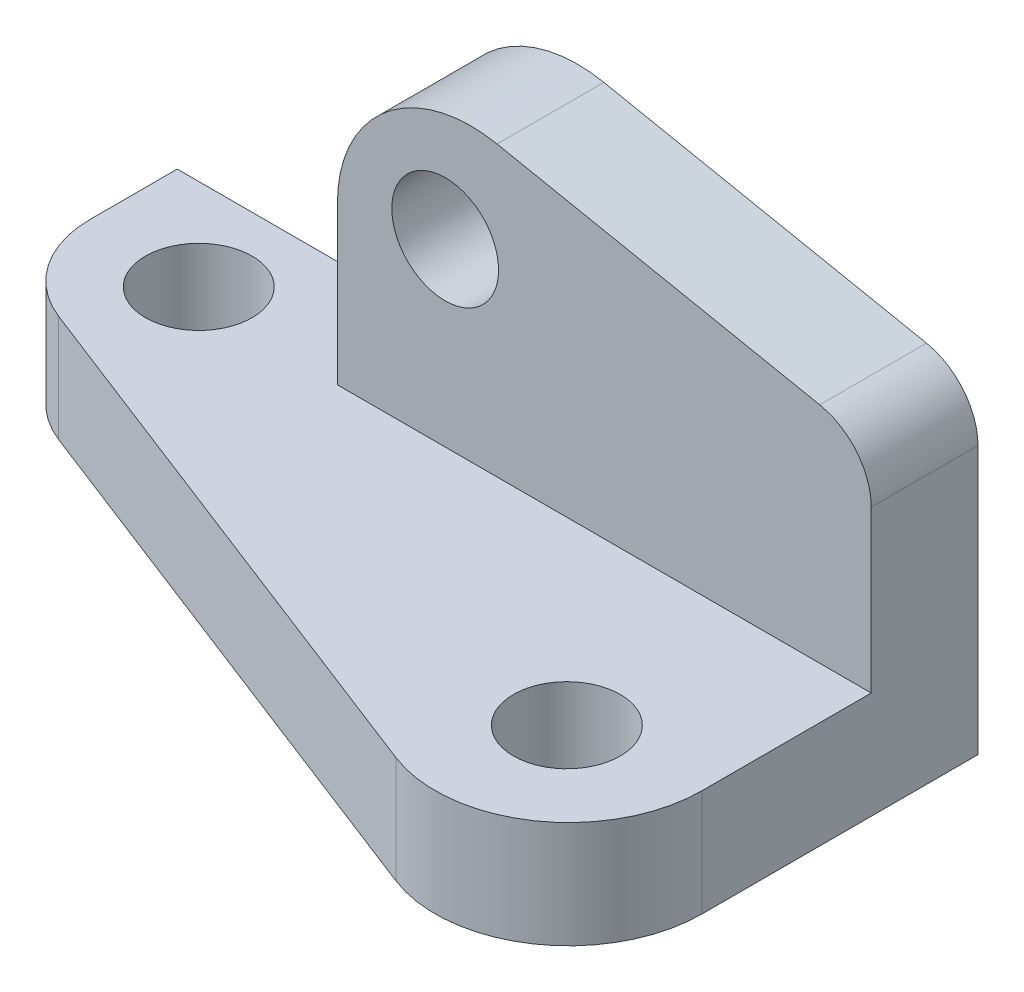
ISO-10303-21;
HEADER;
FILE_DESCRIPTION(('STEP AP214'),'2;1');
FILE_NAME('part.step','',(''),(''),'','','');
FILE_SCHEMA(('AUTOMOTIVE_DESIGN { 1 0 10303 214 1 1 1 1 }'));
ENDSEC;
DATA;
#1=APPLICATION_CONTEXT('core data for automotive mechanical design processes');
#2=APPLICATION_PROTOCOL_DEFINITION('international standard','automotive_design',2000,#1);
#3=PRODUCT_CONTEXT('',#1,'mechanical');
#4=PRODUCT('Part','Part','',(#3));
#5=PRODUCT_RELATED_PRODUCT_CATEGORY('part','',(#4));
#6=PRODUCT_DEFINITION_FORMATION('','',#4);
#7=PRODUCT_DEFINITION_CONTEXT('part definition',#1,'design');
#8=PRODUCT_DEFINITION('design','',#6,#7);
#9=PRODUCT_DEFINITION_SHAPE('','',#8);
#10=(LENGTH_UNIT() NAMED_UNIT(*) SI_UNIT(.MILLI.,.METRE.));
#11=(NAMED_UNIT(*) PLANE_ANGLE_UNIT() SI_UNIT($,.RADIAN.));
#12=(NAMED_UNIT(*) SI_UNIT($,.STERADIAN.) SOLID_ANGLE_UNIT());
#13=UNCERTAINTY_MEASURE_WITH_UNIT(LENGTH_MEASURE(1.E-05),#10,'distance_accuracy_value','');
#14=(GEOMETRIC_REPRESENTATION_CONTEXT(3) GLOBAL_UNCERTAINTY_ASSIGNED_CONTEXT((#13)) GLOBAL_UNIT_ASSIGNED_CONTEXT((#10,
#11,#12)) REPRESENTATION_CONTEXT('',''));
#15=CARTESIAN_POINT('',(0.,0.,0.));
#16=DIRECTION('',(0.,0.,1.));
#17=DIRECTION('',(1.,0.,0.));
#18=AXIS2_PLACEMENT_3D('',#15,#16,#17);
#19=CARTESIAN_POINT('',(20.,20.,16.3519472911813));
#20=DIRECTION('',(0.,1.,0.));
#21=DIRECTION('',(0.,0.,1.));
#22=AXIS2_PLACEMENT_3D('',#19,#20,#21);
#23=PLANE('',#22);
#24=CARTESIAN_POINT('',(126.718781389795,20.,53.737461518237));
#25=DIRECTION('',(0.,1.,0.));
#26=DIRECTION('',(0.,0.,1.));
#27=AXIS2_PLACEMENT_3D('',#24,#25,#26);
#28=CIRCLE('',#27,9.99999999999998);
#29=CARTESIAN_POINT('',(126.718781389795,20.,63.737461518237));
#30=VERTEX_POINT('',#29);
#31=EDGE_CURVE('E225',#30,#30,#28,.T.);
#32=ORIENTED_EDGE('',*,*,#31,.F.);
#33=EDGE_LOOP('',(#32));
#34=FACE_BOUND('',#33,.T.);
#35=CARTESIAN_POINT('',(21.1262693856301,20.,17.1033247004654));
#36=DIRECTION('',(0.,1.,0.));
#37=DIRECTION('',(0.,0.,1.));
#38=AXIS2_PLACEMENT_3D('',#35,#36,#37);
#39=CIRCLE('',#38,9.99999999999999);
#40=CARTESIAN_POINT('',(21.1262693856301,20.,27.1033247004654));
#41=VERTEX_POINT('',#40);
#42=EDGE_CURVE('E219',#41,#41,#39,.T.);
#43=ORIENTED_EDGE('',*,*,#42,.F.);
#44=EDGE_LOOP('',(#43));
#45=FACE_BOUND('',#44,.T.);
#46=DIRECTION('',(1.,0.,0.));
#47=VECTOR('',#46,1.);
#48=CARTESIAN_POINT('',(20.,20.,20.));
#49=LINE('',#48,#47);
#50=CARTESIAN_POINT('',(50.,20.,20.));
#51=VERTEX_POINT('',#50);
#52=CARTESIAN_POINT('',(150.,20.,20.));
#53=VERTEX_POINT('',#52);
#54=EDGE_CURVE('E143',#51,#53,#49,.T.);
#55=ORIENTED_EDGE('',*,*,#54,.F.);
#56=DIRECTION('',(0.,0.,-1.));
#57=VECTOR('',#56,1.);
#58=CARTESIAN_POINT('',(50.,20.,16.3519472911813));
#59=LINE('',#58,#57);
#60=CARTESIAN_POINT('',(50.,20.,0.));
#61=VERTEX_POINT('',#60);
#62=EDGE_CURVE('E124',#51,#61,#59,.T.);
#63=ORIENTED_EDGE('',*,*,#62,.T.);
#64=DIRECTION('',(-1.,0.,0.));
#65=VECTOR('',#64,1.);
#66=CARTESIAN_POINT('',(0.,20.,0.));
#67=LINE('',#66,#65);
#68=CARTESIAN_POINT('',(0.,20.,0.));
#69=VERTEX_POINT('',#68);
#70=EDGE_CURVE('E132',#61,#69,#67,.T.);
#71=ORIENTED_EDGE('',*,*,#70,.T.);
#72=DIRECTION('',(0.,0.,1.));
#73=VECTOR('',#72,1.);
#74=CARTESIAN_POINT('',(0.,20.,0.));
#75=LINE('',#74,#73);
#76=CARTESIAN_POINT('',(0.,20.,16.3519472911813));
#77=VERTEX_POINT('',#76);
#78=EDGE_CURVE('E152',#69,#77,#75,.T.);
#79=ORIENTED_EDGE('',*,*,#78,.T.);
#80=CARTESIAN_POINT('',(20.,20.,16.3519472911813));
#81=DIRECTION('',(0.,1.,0.));
#82=DIRECTION('',(0.,0.,1.));
#83=AXIS2_PLACEMENT_3D('',#80,#81,#82);
#84=CIRCLE('',#83,20.);
#85=CARTESIAN_POINT('',(12.7715748486188,20.,35.));
#86=VERTEX_POINT('',#85);
#87=EDGE_CURVE('E154',#77,#86,#84,.T.);
#88=ORIENTED_EDGE('',*,*,#87,.T.);
#89=DIRECTION('',(0.932402635440934,0.,0.36142125756906));
#90=VECTOR('',#89,1.);
#91=CARTESIAN_POINT('',(115.964468560773,20.,75.));
#92=LINE('',#91,#90);
#93=CARTESIAN_POINT('',(115.964468560773,20.,75.));
#94=VERTEX_POINT('',#93);
#95=EDGE_CURVE('E157',#86,#94,#92,.T.);
#96=ORIENTED_EDGE('',*,*,#95,.T.);
#97=CARTESIAN_POINT('',(125.,20.,51.6899341139767));
#98=DIRECTION('',(0.,1.,0.));
#99=DIRECTION('',(0.,0.,-1.));
#100=AXIS2_PLACEMENT_3D('',#97,#98,#99);
#101=CIRCLE('',#100,25.);
#102=CARTESIAN_POINT('',(150.,20.,51.6899341139767));
#103=VERTEX_POINT('',#102);
#104=EDGE_CURVE('E159',#94,#103,#101,.T.);
#105=ORIENTED_EDGE('',*,*,#104,.T.);
#106=DIRECTION('',(0.,0.,-1.));
#107=VECTOR('',#106,1.);
#108=CARTESIAN_POINT('',(150.,20.,0.));
#109=LINE('',#108,#107);
#110=EDGE_CURVE('E139',#103,#53,#109,.T.);
#111=ORIENTED_EDGE('',*,*,#110,.T.);
#112=EDGE_LOOP('',(#55,#63,#71,#79,#88,#96,#105,#111));
#113=FACE_BOUND('',#112,.T.);
#114=ADVANCED_FACE('F36',(#34,#45,#113),#23,.T.);
#115=CARTESIAN_POINT('',(0.,20.,0.));
#116=DIRECTION('',(1.,0.,0.));
#117=DIRECTION('',(0.,0.,-1.));
#118=AXIS2_PLACEMENT_3D('',#115,#116,#117);
#119=PLANE('',#118);
#120=DIRECTION('',(0.,0.,1.));
#121=VECTOR('',#120,1.);
#122=CARTESIAN_POINT('',(0.,0.,0.));
#123=LINE('',#122,#121);
#124=CARTESIAN_POINT('',(0.,0.,0.));
#125=VERTEX_POINT('',#124);
#126=CARTESIAN_POINT('',(0.,0.,16.3519472911813));
#127=VERTEX_POINT('',#126);
#128=EDGE_CURVE('E144',#125,#127,#123,.T.);
#129=ORIENTED_EDGE('',*,*,#128,.T.);
#130=DIRECTION('',(0.,-1.,0.));
#131=VECTOR('',#130,1.);
#132=CARTESIAN_POINT('',(0.,20.,16.3519472911813));
#133=LINE('',#132,#131);
#134=EDGE_CURVE('E183',#77,#127,#133,.T.);
#135=ORIENTED_EDGE('',*,*,#134,.F.);
#136=ORIENTED_EDGE('',*,*,#78,.F.);
#137=DIRECTION('',(0.,-1.,0.));
#138=VECTOR('',#137,1.);
#139=CARTESIAN_POINT('',(0.,20.,0.));
#140=LINE('',#139,#138);
#141=EDGE_CURVE('E135',#69,#125,#140,.T.);
#142=ORIENTED_EDGE('',*,*,#141,.T.);
#143=EDGE_LOOP('',(#129,#135,#136,#142));
#144=FACE_BOUND('',#143,.T.);
#145=ADVANCED_FACE('F233',(#144),#119,.F.);
#146=CARTESIAN_POINT('',(20.,20.,16.3519472911813));
#147=DIRECTION('',(0.,-1.,0.));
#148=DIRECTION('',(0.,0.,-1.));
#149=AXIS2_PLACEMENT_3D('',#146,#147,#148);
#150=CYLINDRICAL_SURFACE('',#149,20.);
#151=CARTESIAN_POINT('',(20.,0.,16.3519472911813));
#152=DIRECTION('',(0.,1.,0.));
#153=DIRECTION('',(0.,0.,1.));
#154=AXIS2_PLACEMENT_3D('',#151,#152,#153);
#155=CIRCLE('',#154,20.);
#156=CARTESIAN_POINT('',(12.7715748486188,0.,35.));
#157=VERTEX_POINT('',#156);
#158=EDGE_CURVE('E147',#127,#157,#155,.T.);
#159=ORIENTED_EDGE('',*,*,#158,.T.);
#160=DIRECTION('',(0.,-1.,0.));
#161=VECTOR('',#160,1.);
#162=CARTESIAN_POINT('',(12.7715748486188,20.,35.));
#163=LINE('',#162,#161);
#164=EDGE_CURVE('E180',#86,#157,#163,.T.);
#165=ORIENTED_EDGE('',*,*,#164,.F.);
#166=ORIENTED_EDGE('',*,*,#87,.F.);
#167=ORIENTED_EDGE('',*,*,#134,.T.);
#168=EDGE_LOOP('',(#159,#165,#166,#167));
#169=FACE_BOUND('',#168,.T.);
#170=ADVANCED_FACE('F278',(#169),#150,.T.);
#171=CARTESIAN_POINT('',(115.964468560773,20.,75.));
#172=DIRECTION('',(0.361421257569061,0.,-0.932402635440934));
#173=DIRECTION('',(-0.932402635440934,0.,-0.361421257569061));
#174=AXIS2_PLACEMENT_3D('',#171,#172,#173);
#175=PLANE('',#174);
#176=DIRECTION('',(0.932402635440934,0.,0.36142125756906));
#177=VECTOR('',#176,1.);
#178=CARTESIAN_POINT('',(115.964468560773,0.,75.));
#179=LINE('',#178,#177);
#180=CARTESIAN_POINT('',(115.964468560773,0.,75.));
#181=VERTEX_POINT('',#180);
#182=EDGE_CURVE('E163',#157,#181,#179,.T.);
#183=ORIENTED_EDGE('',*,*,#182,.T.);
#184=DIRECTION('',(0.,-1.,0.));
#185=VECTOR('',#184,1.);
#186=CARTESIAN_POINT('',(115.964468560773,20.,75.));
#187=LINE('',#186,#185);
#188=EDGE_CURVE('E177',#94,#181,#187,.T.);
#189=ORIENTED_EDGE('',*,*,#188,.F.);
#190=ORIENTED_EDGE('',*,*,#95,.F.);
#191=ORIENTED_EDGE('',*,*,#164,.T.);
#192=EDGE_LOOP('',(#183,#189,#190,#191));
#193=FACE_BOUND('',#192,.T.);
#194=ADVANCED_FACE('F274',(#193),#175,.F.);
#195=CARTESIAN_POINT('',(125.,20.,51.6899341139767));
#196=DIRECTION('',(0.,-1.,0.));
#197=DIRECTION('',(0.,0.,-1.));
#198=AXIS2_PLACEMENT_3D('',#195,#196,#197);
#199=CYLINDRICAL_SURFACE('',#198,25.);
#200=CARTESIAN_POINT('',(125.,0.,51.6899341139767));
#201=DIRECTION('',(0.,1.,0.));
#202=DIRECTION('',(0.,0.,-1.));
#203=AXIS2_PLACEMENT_3D('',#200,#201,#202);
#204=CIRCLE('',#203,25.);
#205=CARTESIAN_POINT('',(150.,0.,51.6899341139767));
#206=VERTEX_POINT('',#205);
#207=EDGE_CURVE('E165',#181,#206,#204,.T.);
#208=ORIENTED_EDGE('',*,*,#207,.T.);
#209=DIRECTION('',(0.,-1.,0.));
#210=VECTOR('',#209,1.);
#211=CARTESIAN_POINT('',(150.,20.,51.6899341139767));
#212=LINE('',#211,#210);
#213=EDGE_CURVE('E174',#103,#206,#212,.T.);
#214=ORIENTED_EDGE('',*,*,#213,.F.);
#215=ORIENTED_EDGE('',*,*,#104,.F.);
#216=ORIENTED_EDGE('',*,*,#188,.T.);
#217=EDGE_LOOP('',(#208,#214,#215,#216));
#218=FACE_BOUND('',#217,.T.);
#219=ADVANCED_FACE('F271',(#218),#199,.T.);
#220=CARTESIAN_POINT('',(150.,20.,0.));
#221=DIRECTION('',(-1.,0.,0.));
#222=DIRECTION('',(0.,0.,1.));
#223=AXIS2_PLACEMENT_3D('',#220,#221,#222);
#224=PLANE('',#223);
#225=DIRECTION('',(0.,-1.,0.));
#226=VECTOR('',#225,1.);
#227=CARTESIAN_POINT('',(150.,20.,0.));
#228=LINE('',#227,#226);
#229=CARTESIAN_POINT('',(150.,50.1623531673773,0.));
#230=VERTEX_POINT('',#229);
#231=CARTESIAN_POINT('',(150.,0.,0.));
#232=VERTEX_POINT('',#231);
#233=EDGE_CURVE('E172',#230,#232,#228,.T.);
#234=ORIENTED_EDGE('',*,*,#233,.F.);
#235=DIRECTION('',(0.,0.,-1.));
#236=VECTOR('',#235,1.);
#237=CARTESIAN_POINT('',(150.,50.1623531673773,0.));
#238=LINE('',#237,#236);
#239=CARTESIAN_POINT('',(150.,50.1623531673773,20.));
#240=VERTEX_POINT('',#239);
#241=EDGE_CURVE('E44',#230,#240,#238,.F.);
#242=ORIENTED_EDGE('',*,*,#241,.T.);
#243=DIRECTION('',(0.,1.,0.));
#244=VECTOR('',#243,1.);
#245=CARTESIAN_POINT('',(150.,0.,20.));
#246=LINE('',#245,#244);
#247=EDGE_CURVE('E128',#53,#240,#246,.T.);
#248=ORIENTED_EDGE('',*,*,#247,.F.);
#249=ORIENTED_EDGE('',*,*,#110,.F.);
#250=ORIENTED_EDGE('',*,*,#213,.T.);
#251=DIRECTION('',(0.,0.,-1.));
#252=VECTOR('',#251,1.);
#253=CARTESIAN_POINT('',(150.,0.,0.));
#254=LINE('',#253,#252);
#255=EDGE_CURVE('E167',#206,#232,#254,.T.);
#256=ORIENTED_EDGE('',*,*,#255,.T.);
#257=EDGE_LOOP('',(#234,#242,#248,#249,#250,#256));
#258=FACE_BOUND('',#257,.T.);
#259=ADVANCED_FACE('F267',(#258),#224,.F.);
#260=CARTESIAN_POINT('',(0.,20.,0.));
#261=DIRECTION('',(0.,0.,1.));
#262=DIRECTION('',(1.,0.,0.));
#263=AXIS2_PLACEMENT_3D('',#260,#261,#262);
#264=PLANE('',#263);
#265=CARTESIAN_POINT('',(70.1851600843924,53.7137408008803,0.));
#266=DIRECTION('',(0.,0.,1.));
#267=DIRECTION('',(1.,0.,0.));
#268=AXIS2_PLACEMENT_3D('',#265,#266,#267);
#269=CIRCLE('',#268,9.99999999999999);
#270=CARTESIAN_POINT('',(80.1851600843924,53.7137408008803,0.));
#271=VERTEX_POINT('',#270);
#272=EDGE_CURVE('E205',#271,#271,#269,.T.);
#273=ORIENTED_EDGE('',*,*,#272,.T.);
#274=EDGE_LOOP('',(#273));
#275=FACE_BOUND('',#274,.T.);
#276=DIRECTION('',(-0.98058067569092,0.196116135138184,0.));
#277=VECTOR('',#276,1.);
#278=CARTESIAN_POINT('',(150.,60.,0.));
#279=LINE('',#278,#277);
#280=CARTESIAN_POINT('',(140.353393621658,61.9293212756684,0.));
#281=VERTEX_POINT('',#280);
#282=CARTESIAN_POINT('',(79.9029033784546,74.0194193243091,0.));
#283=VERTEX_POINT('',#282);
#284=EDGE_CURVE('E129',#281,#283,#279,.T.);
#285=ORIENTED_EDGE('',*,*,#284,.F.);
#286=CARTESIAN_POINT('',(138.,50.1623531673773,0.));
#287=DIRECTION('',(0.,0.,1.));
#288=DIRECTION('',(1.,0.,0.));
#289=AXIS2_PLACEMENT_3D('',#286,#287,#288);
#290=CIRCLE('',#289,12.);
#291=EDGE_CURVE('E58',#281,#230,#290,.F.);
#292=ORIENTED_EDGE('',*,*,#291,.T.);
#293=ORIENTED_EDGE('',*,*,#233,.T.);
#294=DIRECTION('',(-1.,0.,0.));
#295=VECTOR('',#294,1.);
#296=CARTESIAN_POINT('',(0.,0.,0.));
#297=LINE('',#296,#295);
#298=EDGE_CURVE('E155',#232,#125,#297,.T.);
#299=ORIENTED_EDGE('',*,*,#298,.T.);
#300=ORIENTED_EDGE('',*,*,#141,.F.);
#301=ORIENTED_EDGE('',*,*,#70,.F.);
#302=DIRECTION('',(0.,-1.,0.));
#303=VECTOR('',#302,1.);
#304=CARTESIAN_POINT('',(50.,0.,0.));
#305=LINE('',#304,#303);
#306=CARTESIAN_POINT('',(50.,49.5049024320361,0.));
#307=VERTEX_POINT('',#306);
#308=EDGE_CURVE('E119',#307,#61,#305,.T.);
#309=ORIENTED_EDGE('',*,*,#308,.F.);
#310=CARTESIAN_POINT('',(75.,49.5049024320361,0.));
#311=DIRECTION('',(0.,0.,1.));
#312=DIRECTION('',(1.,0.,0.));
#313=AXIS2_PLACEMENT_3D('',#310,#311,#312);
#314=CIRCLE('',#313,25.);
#315=EDGE_CURVE('E187',#307,#283,#314,.F.);
#316=ORIENTED_EDGE('',*,*,#315,.T.);
#317=EDGE_LOOP('',(#285,#292,#293,#299,#300,#301,#309,#316));
#318=FACE_BOUND('',#317,.T.);
#319=ADVANCED_FACE('F133',(#275,#318),#264,.F.);
#320=CARTESIAN_POINT('',(20.,0.,16.3519472911813));
#321=DIRECTION('',(0.,1.,0.));
#322=DIRECTION('',(0.,0.,1.));
#323=AXIS2_PLACEMENT_3D('',#320,#321,#322);
#324=PLANE('',#323);
#325=CARTESIAN_POINT('',(126.718781389795,0.,53.737461518237));
#326=DIRECTION('',(0.,1.,0.));
#327=DIRECTION('',(0.,0.,1.));
#328=AXIS2_PLACEMENT_3D('',#325,#326,#327);
#329=CIRCLE('',#328,9.99999999999998);
#330=CARTESIAN_POINT('',(126.718781389795,0.,63.737461518237));
#331=VERTEX_POINT('',#330);
#332=EDGE_CURVE('E222',#331,#331,#329,.T.);
#333=ORIENTED_EDGE('',*,*,#332,.T.);
#334=EDGE_LOOP('',(#333));
#335=FACE_BOUND('',#334,.T.);
#336=CARTESIAN_POINT('',(21.1262693856301,0.,17.1033247004654));
#337=DIRECTION('',(0.,1.,0.));
#338=DIRECTION('',(0.,0.,1.));
#339=AXIS2_PLACEMENT_3D('',#336,#337,#338);
#340=CIRCLE('',#339,9.99999999999999);
#341=CARTESIAN_POINT('',(21.1262693856301,0.,27.1033247004654));
#342=VERTEX_POINT('',#341);
#343=EDGE_CURVE('E216',#342,#342,#340,.T.);
#344=ORIENTED_EDGE('',*,*,#343,.T.);
#345=EDGE_LOOP('',(#344));
#346=FACE_BOUND('',#345,.T.);
#347=ORIENTED_EDGE('',*,*,#128,.F.);
#348=ORIENTED_EDGE('',*,*,#298,.F.);
#349=ORIENTED_EDGE('',*,*,#255,.F.);
#350=ORIENTED_EDGE('',*,*,#207,.F.);
#351=ORIENTED_EDGE('',*,*,#182,.F.);
#352=ORIENTED_EDGE('',*,*,#158,.F.);
#353=EDGE_LOOP('',(#347,#348,#349,#350,#351,#352));
#354=FACE_BOUND('',#353,.T.);
#355=ADVANCED_FACE('F260',(#335,#346,#354),#324,.F.);
#356=CARTESIAN_POINT('',(150.,60.,20.));
#357=DIRECTION('',(-0.196116135138184,-0.98058067569092,0.));
#358=DIRECTION('',(0.98058067569092,-0.196116135138184,0.));
#359=AXIS2_PLACEMENT_3D('',#356,#357,#358);
#360=PLANE('',#359);
#361=DIRECTION('',(-0.98058067569092,0.196116135138184,0.));
#362=VECTOR('',#361,1.);
#363=CARTESIAN_POINT('',(150.,60.,20.));
#364=LINE('',#363,#362);
#365=CARTESIAN_POINT('',(140.353393621658,61.9293212756684,20.));
#366=VERTEX_POINT('',#365);
#367=CARTESIAN_POINT('',(79.9029033784546,74.0194193243091,20.));
#368=VERTEX_POINT('',#367);
#369=EDGE_CURVE('E201',#366,#368,#364,.T.);
#370=ORIENTED_EDGE('',*,*,#369,.F.);
#371=DIRECTION('',(0.,0.,-1.));
#372=VECTOR('',#371,1.);
#373=CARTESIAN_POINT('',(140.353393621658,61.9293212756684,20.));
#374=LINE('',#373,#372);
#375=EDGE_CURVE('E194',#366,#281,#374,.T.);
#376=ORIENTED_EDGE('',*,*,#375,.T.);
#377=ORIENTED_EDGE('',*,*,#284,.T.);
#378=DIRECTION('',(0.,0.,-1.));
#379=VECTOR('',#378,1.);
#380=CARTESIAN_POINT('',(79.9029033784546,74.0194193243091,20.));
#381=LINE('',#380,#379);
#382=EDGE_CURVE('E189',#283,#368,#381,.F.);
#383=ORIENTED_EDGE('',*,*,#382,.T.);
#384=EDGE_LOOP('',(#370,#376,#377,#383));
#385=FACE_BOUND('',#384,.T.);
#386=ADVANCED_FACE('F200',(#385),#360,.F.);
#387=CARTESIAN_POINT('',(50.,0.,20.));
#388=DIRECTION('',(1.,0.,0.));
#389=DIRECTION('',(0.,0.,-1.));
#390=AXIS2_PLACEMENT_3D('',#387,#388,#389);
#391=PLANE('',#390);
#392=DIRECTION('',(0.,-1.,0.));
#393=VECTOR('',#392,1.);
#394=CARTESIAN_POINT('',(50.,0.,20.));
#395=LINE('',#394,#393);
#396=CARTESIAN_POINT('',(50.,49.5049024320361,20.));
#397=VERTEX_POINT('',#396);
#398=EDGE_CURVE('E149',#397,#51,#395,.T.);
#399=ORIENTED_EDGE('',*,*,#398,.F.);
#400=DIRECTION('',(0.,0.,-1.));
#401=VECTOR('',#400,1.);
#402=CARTESIAN_POINT('',(50.,49.5049024320361,20.));
#403=LINE('',#402,#401);
#404=EDGE_CURVE('E126',#397,#307,#403,.T.);
#405=ORIENTED_EDGE('',*,*,#404,.T.);
#406=ORIENTED_EDGE('',*,*,#308,.T.);
#407=ORIENTED_EDGE('',*,*,#62,.F.);
#408=EDGE_LOOP('',(#399,#405,#406,#407));
#409=FACE_BOUND('',#408,.T.);
#410=ADVANCED_FACE('F122',(#409),#391,.F.);
#411=CARTESIAN_POINT('',(0.,0.,20.));
#412=DIRECTION('',(0.,0.,1.));
#413=DIRECTION('',(1.,0.,0.));
#414=AXIS2_PLACEMENT_3D('',#411,#412,#413);
#415=PLANE('',#414);
#416=CARTESIAN_POINT('',(70.1851600843924,53.7137408008803,20.));
#417=DIRECTION('',(0.,0.,1.));
#418=DIRECTION('',(1.,0.,0.));
#419=AXIS2_PLACEMENT_3D('',#416,#417,#418);
#420=CIRCLE('',#419,9.99999999999998);
#421=CARTESIAN_POINT('',(80.1851600843923,53.7137408008803,20.));
#422=VERTEX_POINT('',#421);
#423=EDGE_CURVE('E208',#422,#422,#420,.T.);
#424=ORIENTED_EDGE('',*,*,#423,.F.);
#425=EDGE_LOOP('',(#424));
#426=FACE_BOUND('',#425,.T.);
#427=ORIENTED_EDGE('',*,*,#247,.T.);
#428=CARTESIAN_POINT('',(138.,50.1623531673773,20.));
#429=DIRECTION('',(0.,0.,1.));
#430=DIRECTION('',(1.,0.,0.));
#431=AXIS2_PLACEMENT_3D('',#428,#429,#430);
#432=CIRCLE('',#431,12.);
#433=EDGE_CURVE('E11',#240,#366,#432,.T.);
#434=ORIENTED_EDGE('',*,*,#433,.T.);
#435=ORIENTED_EDGE('',*,*,#369,.T.);
#436=CARTESIAN_POINT('',(75.,49.5049024320361,20.));
#437=DIRECTION('',(0.,0.,1.));
#438=DIRECTION('',(1.,0.,0.));
#439=AXIS2_PLACEMENT_3D('',#436,#437,#438);
#440=CIRCLE('',#439,25.);
#441=EDGE_CURVE('E192',#368,#397,#440,.T.);
#442=ORIENTED_EDGE('',*,*,#441,.T.);
#443=ORIENTED_EDGE('',*,*,#398,.T.);
#444=ORIENTED_EDGE('',*,*,#54,.T.);
#445=EDGE_LOOP('',(#427,#434,#435,#442,#443,#444));
#446=FACE_BOUND('',#445,.T.);
#447=ADVANCED_FACE('F252',(#426,#446),#415,.T.);
#448=CARTESIAN_POINT('',(75.,49.5049024320361,20.));
#449=DIRECTION('',(0.,0.,-1.));
#450=DIRECTION('',(-1.,0.,0.));
#451=AXIS2_PLACEMENT_3D('',#448,#449,#450);
#452=CYLINDRICAL_SURFACE('',#451,25.);
#453=ORIENTED_EDGE('',*,*,#441,.F.);
#454=ORIENTED_EDGE('',*,*,#382,.F.);
#455=ORIENTED_EDGE('',*,*,#315,.F.);
#456=ORIENTED_EDGE('',*,*,#404,.F.);
#457=EDGE_LOOP('',(#453,#454,#455,#456));
#458=FACE_BOUND('',#457,.T.);
#459=ADVANCED_FACE('F255',(#458),#452,.T.);
#460=CARTESIAN_POINT('',(138.,50.1623531673773,20.));
#461=DIRECTION('',(0.,0.,-1.));
#462=DIRECTION('',(-1.,0.,0.));
#463=AXIS2_PLACEMENT_3D('',#460,#461,#462);
#464=CYLINDRICAL_SURFACE('',#463,12.);
#465=ORIENTED_EDGE('',*,*,#433,.F.);
#466=ORIENTED_EDGE('',*,*,#241,.F.);
#467=ORIENTED_EDGE('',*,*,#291,.F.);
#468=ORIENTED_EDGE('',*,*,#375,.F.);
#469=EDGE_LOOP('',(#465,#466,#467,#468));
#470=FACE_BOUND('',#469,.T.);
#471=ADVANCED_FACE('F38',(#470),#464,.T.);
#472=CARTESIAN_POINT('',(70.1851600843924,53.7137408008803,20.));
#473=DIRECTION('',(0.,0.,1.));
#474=DIRECTION('',(1.,0.,0.));
#475=AXIS2_PLACEMENT_3D('',#472,#473,#474);
#476=CYLINDRICAL_SURFACE('',#475,9.99999999999999);
#477=ORIENTED_EDGE('',*,*,#272,.F.);
#478=EDGE_LOOP('',(#477));
#479=FACE_BOUND('',#478,.T.);
#480=ORIENTED_EDGE('',*,*,#423,.T.);
#481=EDGE_LOOP('',(#480));
#482=FACE_BOUND('',#481,.T.);
#483=ADVANCED_FACE('F239',(#479,#482),#476,.F.);
#484=CARTESIAN_POINT('',(21.1262693856301,20.,17.1033247004654));
#485=DIRECTION('',(0.,1.,0.));
#486=DIRECTION('',(0.,0.,1.));
#487=AXIS2_PLACEMENT_3D('',#484,#485,#486);
#488=CYLINDRICAL_SURFACE('',#487,9.99999999999999);
#489=ORIENTED_EDGE('',*,*,#343,.F.);
#490=EDGE_LOOP('',(#489));
#491=FACE_BOUND('',#490,.T.);
#492=ORIENTED_EDGE('',*,*,#42,.T.);
#493=EDGE_LOOP('',(#492));
#494=FACE_BOUND('',#493,.T.);
#495=ADVANCED_FACE('F237',(#491,#494),#488,.F.);
#496=CARTESIAN_POINT('',(126.718781389795,20.,53.737461518237));
#497=DIRECTION('',(0.,1.,0.));
#498=DIRECTION('',(0.,0.,1.));
#499=AXIS2_PLACEMENT_3D('',#496,#497,#498);
#500=CYLINDRICAL_SURFACE('',#499,9.99999999999998);
#501=ORIENTED_EDGE('',*,*,#332,.F.);
#502=EDGE_LOOP('',(#501));
#503=FACE_BOUND('',#502,.T.);
#504=ORIENTED_EDGE('',*,*,#31,.T.);
#505=EDGE_LOOP('',(#504));
#506=FACE_BOUND('',#505,.T.);
#507=ADVANCED_FACE('F229',(#503,#506),#500,.F.);
#508=CLOSED_SHELL('',(#114,#145,#170,#194,#219,#259,#319,#355,#386,#410,#447,#459,#471,#483,
#495,#507));
#509=MANIFOLD_SOLID_BREP('B2',#508);
#510=ADVANCED_BREP_SHAPE_REPRESENTATION('',(#18,#509),#14);
#511=SHAPE_DEFINITION_REPRESENTATION(#9,#510);
ENDSEC;
END-ISO-10303-21;
